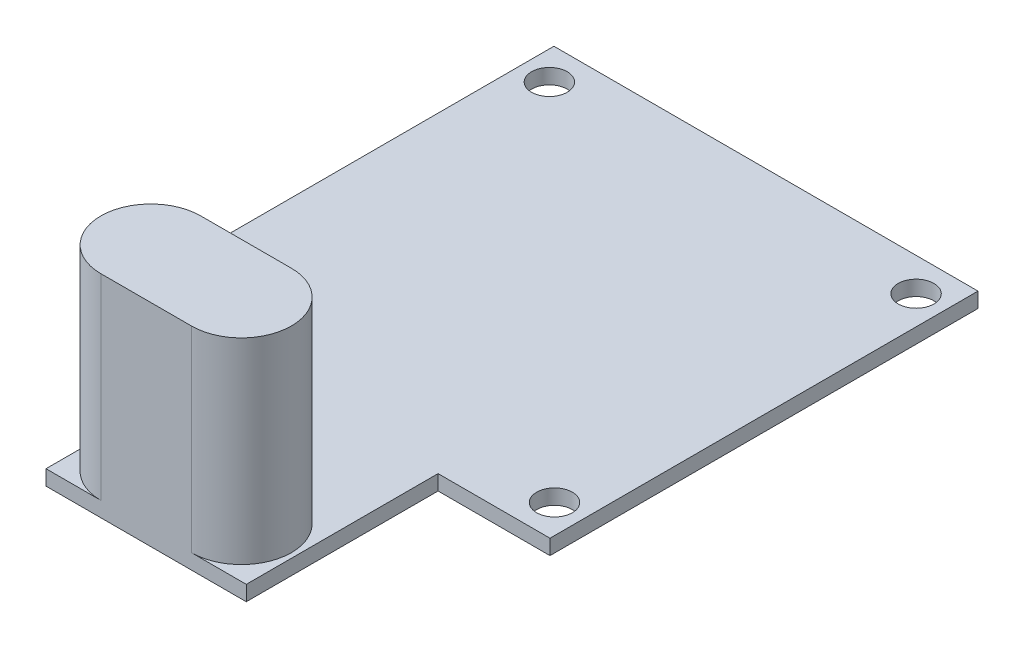
ISO-10303-21;
HEADER;
FILE_DESCRIPTION(('STEP AP214'),'2;1');
FILE_NAME('part.step','',(''),(''),'','','');
FILE_SCHEMA(('AUTOMOTIVE_DESIGN { 1 0 10303 214 1 1 1 1 }'));
ENDSEC;
DATA;
#1=APPLICATION_CONTEXT('core data for automotive mechanical design processes');
#2=APPLICATION_PROTOCOL_DEFINITION('international standard','automotive_design',2000,#1);
#3=PRODUCT_CONTEXT('',#1,'mechanical');
#4=PRODUCT('Part','Part','',(#3));
#5=PRODUCT_RELATED_PRODUCT_CATEGORY('part','',(#4));
#6=PRODUCT_DEFINITION_FORMATION('','',#4);
#7=PRODUCT_DEFINITION_CONTEXT('part definition',#1,'design');
#8=PRODUCT_DEFINITION('design','',#6,#7);
#9=PRODUCT_DEFINITION_SHAPE('','',#8);
#10=(LENGTH_UNIT() NAMED_UNIT(*) SI_UNIT(.MILLI.,.METRE.));
#11=(NAMED_UNIT(*) PLANE_ANGLE_UNIT() SI_UNIT($,.RADIAN.));
#12=(NAMED_UNIT(*) SI_UNIT($,.STERADIAN.) SOLID_ANGLE_UNIT());
#13=UNCERTAINTY_MEASURE_WITH_UNIT(LENGTH_MEASURE(1.E-05),#10,'distance_accuracy_value','');
#14=(GEOMETRIC_REPRESENTATION_CONTEXT(3) GLOBAL_UNCERTAINTY_ASSIGNED_CONTEXT((#13)) GLOBAL_UNIT_ASSIGNED_CONTEXT((#10,
#11,#12)) REPRESENTATION_CONTEXT('',''));
#15=CARTESIAN_POINT('',(0.,0.,0.));
#16=DIRECTION('',(0.,0.,1.));
#17=DIRECTION('',(1.,0.,0.));
#18=AXIS2_PLACEMENT_3D('',#15,#16,#17);
#19=CARTESIAN_POINT('',(0.,0.635,0.));
#20=DIRECTION('',(1.,0.,0.));
#21=DIRECTION('',(0.,0.,-1.));
#22=AXIS2_PLACEMENT_3D('',#19,#20,#21);
#23=PLANE('',#22);
#24=DIRECTION('',(0.,0.,1.));
#25=VECTOR('',#24,1.);
#26=CARTESIAN_POINT('',(0.,-0.635,0.));
#27=LINE('',#26,#25);
#28=CARTESIAN_POINT('',(0.,-0.635,-35.9918));
#29=VERTEX_POINT('',#28);
#30=CARTESIAN_POINT('',(0.,-0.635,0.));
#31=VERTEX_POINT('',#30);
#32=EDGE_CURVE('E153',#29,#31,#27,.T.);
#33=ORIENTED_EDGE('',*,*,#32,.T.);
#34=DIRECTION('',(0.,-1.,0.));
#35=VECTOR('',#34,1.);
#36=CARTESIAN_POINT('',(0.,0.635,0.));
#37=LINE('',#36,#35);
#38=CARTESIAN_POINT('',(0.,0.635,0.));
#39=VERTEX_POINT('',#38);
#40=EDGE_CURVE('E11',#39,#31,#37,.T.);
#41=ORIENTED_EDGE('',*,*,#40,.F.);
#42=DIRECTION('',(0.,0.,1.));
#43=VECTOR('',#42,1.);
#44=CARTESIAN_POINT('',(0.,0.635,0.));
#45=LINE('',#44,#43);
#46=CARTESIAN_POINT('',(0.,0.635,-35.9918));
#47=VERTEX_POINT('',#46);
#48=EDGE_CURVE('E162',#47,#39,#45,.T.);
#49=ORIENTED_EDGE('',*,*,#48,.F.);
#50=DIRECTION('',(0.,-1.,0.));
#51=VECTOR('',#50,1.);
#52=CARTESIAN_POINT('',(0.,0.635,-35.9918));
#53=LINE('',#52,#51);
#54=EDGE_CURVE('E180',#47,#29,#53,.T.);
#55=ORIENTED_EDGE('',*,*,#54,.T.);
#56=EDGE_LOOP('',(#33,#41,#49,#55));
#57=FACE_BOUND('',#56,.T.);
#58=ADVANCED_FACE('F43',(#57),#23,.F.);
#59=CARTESIAN_POINT('',(0.,0.635,0.));
#60=DIRECTION('',(0.,0.,-1.));
#61=DIRECTION('',(-1.,0.,0.));
#62=AXIS2_PLACEMENT_3D('',#59,#60,#61);
#63=PLANE('',#62);
#64=DIRECTION('',(1.,0.,0.));
#65=VECTOR('',#64,1.);
#66=CARTESIAN_POINT('',(0.,-0.635,0.));
#67=LINE('',#66,#65);
#68=CARTESIAN_POINT('',(9.4107,-0.635,0.));
#69=VERTEX_POINT('',#68);
#70=EDGE_CURVE('E156',#31,#69,#67,.T.);
#71=ORIENTED_EDGE('',*,*,#70,.T.);
#72=DIRECTION('',(0.,-1.,0.));
#73=VECTOR('',#72,1.);
#74=CARTESIAN_POINT('',(9.4107,0.635,0.));
#75=LINE('',#74,#73);
#76=CARTESIAN_POINT('',(9.4107,0.635,0.));
#77=VERTEX_POINT('',#76);
#78=EDGE_CURVE('E50',#77,#69,#75,.T.);
#79=ORIENTED_EDGE('',*,*,#78,.F.);
#80=DIRECTION('',(1.,0.,0.));
#81=VECTOR('',#80,1.);
#82=CARTESIAN_POINT('',(0.,0.635,0.));
#83=LINE('',#82,#81);
#84=EDGE_CURVE('E165',#39,#77,#83,.T.);
#85=ORIENTED_EDGE('',*,*,#84,.F.);
#86=ORIENTED_EDGE('',*,*,#40,.T.);
#87=EDGE_LOOP('',(#71,#79,#85,#86));
#88=FACE_BOUND('',#87,.T.);
#89=ADVANCED_FACE('F256',(#88),#63,.F.);
#90=CARTESIAN_POINT('',(9.4107,0.635,0.));
#91=DIRECTION('',(1.,0.,0.));
#92=DIRECTION('',(0.,0.,-1.));
#93=AXIS2_PLACEMENT_3D('',#90,#91,#92);
#94=PLANE('',#93);
#95=DIRECTION('',(0.,0.,1.));
#96=VECTOR('',#95,1.);
#97=CARTESIAN_POINT('',(9.4107,-0.635,0.));
#98=LINE('',#97,#96);
#99=CARTESIAN_POINT('',(9.4107,-0.635,16.129));
#100=VERTEX_POINT('',#99);
#101=EDGE_CURVE('E183',#69,#100,#98,.T.);
#102=ORIENTED_EDGE('',*,*,#101,.T.);
#103=DIRECTION('',(0.,-1.,0.));
#104=VECTOR('',#103,1.);
#105=CARTESIAN_POINT('',(9.4107,0.635,16.129));
#106=LINE('',#105,#104);
#107=CARTESIAN_POINT('',(9.4107,0.635,16.129));
#108=VERTEX_POINT('',#107);
#109=EDGE_CURVE('E208',#108,#100,#106,.T.);
#110=ORIENTED_EDGE('',*,*,#109,.F.);
#111=DIRECTION('',(0.,0.,1.));
#112=VECTOR('',#111,1.);
#113=CARTESIAN_POINT('',(9.4107,0.635,0.));
#114=LINE('',#113,#112);
#115=EDGE_CURVE('E168',#77,#108,#114,.T.);
#116=ORIENTED_EDGE('',*,*,#115,.F.);
#117=ORIENTED_EDGE('',*,*,#78,.T.);
#118=EDGE_LOOP('',(#102,#110,#116,#117));
#119=FACE_BOUND('',#118,.T.);
#120=ADVANCED_FACE('F215',(#119),#94,.F.);
#121=CARTESIAN_POINT('',(9.4107,0.635,16.129));
#122=DIRECTION('',(0.,0.,-1.));
#123=DIRECTION('',(-1.,0.,0.));
#124=AXIS2_PLACEMENT_3D('',#121,#122,#123);
#125=PLANE('',#124);
#126=DIRECTION('',(1.,0.,0.));
#127=VECTOR('',#126,1.);
#128=CARTESIAN_POINT('',(9.4107,-0.635,16.129));
#129=LINE('',#128,#127);
#130=CARTESIAN_POINT('',(26.2509,-0.635,16.129));
#131=VERTEX_POINT('',#130);
#132=EDGE_CURVE('E185',#100,#131,#129,.T.);
#133=ORIENTED_EDGE('',*,*,#132,.T.);
#134=DIRECTION('',(0.,-1.,0.));
#135=VECTOR('',#134,1.);
#136=CARTESIAN_POINT('',(26.2509,0.635,16.129));
#137=LINE('',#136,#135);
#138=CARTESIAN_POINT('',(26.2509,0.635,16.129));
#139=VERTEX_POINT('',#138);
#140=EDGE_CURVE('E205',#139,#131,#137,.T.);
#141=ORIENTED_EDGE('',*,*,#140,.F.);
#142=DIRECTION('',(1.,0.,0.));
#143=VECTOR('',#142,1.);
#144=CARTESIAN_POINT('',(9.4107,0.635,16.129));
#145=LINE('',#144,#143);
#146=CARTESIAN_POINT('',(21.6408,0.635,16.129));
#147=VERTEX_POINT('',#146);
#148=EDGE_CURVE('E170',#147,#139,#145,.T.);
#149=ORIENTED_EDGE('',*,*,#148,.F.);
#150=DIRECTION('',(0.,-1.,0.));
#151=VECTOR('',#150,1.);
#152=CARTESIAN_POINT('',(21.6408,17.145,16.129));
#153=LINE('',#152,#151);
#154=CARTESIAN_POINT('',(21.6408,17.145,16.129));
#155=VERTEX_POINT('',#154);
#156=EDGE_CURVE('E137',#155,#147,#153,.T.);
#157=ORIENTED_EDGE('',*,*,#156,.F.);
#158=DIRECTION('',(1.,0.,0.));
#159=VECTOR('',#158,1.);
#160=CARTESIAN_POINT('',(14.0208,17.145,16.129));
#161=LINE('',#160,#159);
#162=CARTESIAN_POINT('',(14.0208,17.145,16.129));
#163=VERTEX_POINT('',#162);
#164=EDGE_CURVE('E130',#163,#155,#161,.T.);
#165=ORIENTED_EDGE('',*,*,#164,.F.);
#166=DIRECTION('',(0.,-1.,0.));
#167=VECTOR('',#166,1.);
#168=CARTESIAN_POINT('',(14.0208,17.145,16.129));
#169=LINE('',#168,#167);
#170=CARTESIAN_POINT('',(14.0208,0.635,16.129));
#171=VERTEX_POINT('',#170);
#172=EDGE_CURVE('E135',#163,#171,#169,.T.);
#173=ORIENTED_EDGE('',*,*,#172,.T.);
#174=EDGE_CURVE('E171',#108,#171,#145,.T.);
#175=ORIENTED_EDGE('',*,*,#174,.F.);
#176=ORIENTED_EDGE('',*,*,#109,.T.);
#177=EDGE_LOOP('',(#133,#141,#149,#157,#165,#173,#175,#176));
#178=FACE_BOUND('',#177,.T.);
#179=ADVANCED_FACE('F132',(#178),#125,.F.);
#180=CARTESIAN_POINT('',(26.2509,0.635,0.));
#181=DIRECTION('',(-1.,0.,0.));
#182=DIRECTION('',(0.,0.,1.));
#183=AXIS2_PLACEMENT_3D('',#180,#181,#182);
#184=PLANE('',#183);
#185=DIRECTION('',(0.,0.,-1.));
#186=VECTOR('',#185,1.);
#187=CARTESIAN_POINT('',(26.2509,-0.635,0.));
#188=LINE('',#187,#186);
#189=CARTESIAN_POINT('',(26.2509,-0.635,0.));
#190=VERTEX_POINT('',#189);
#191=EDGE_CURVE('E187',#131,#190,#188,.T.);
#192=ORIENTED_EDGE('',*,*,#191,.T.);
#193=DIRECTION('',(0.,-1.,0.));
#194=VECTOR('',#193,1.);
#195=CARTESIAN_POINT('',(26.2509,0.635,0.));
#196=LINE('',#195,#194);
#197=CARTESIAN_POINT('',(26.2509,0.635,0.));
#198=VERTEX_POINT('',#197);
#199=EDGE_CURVE('E202',#198,#190,#196,.T.);
#200=ORIENTED_EDGE('',*,*,#199,.F.);
#201=DIRECTION('',(0.,0.,-1.));
#202=VECTOR('',#201,1.);
#203=CARTESIAN_POINT('',(26.2509,0.635,0.));
#204=LINE('',#203,#202);
#205=EDGE_CURVE('E173',#139,#198,#204,.T.);
#206=ORIENTED_EDGE('',*,*,#205,.F.);
#207=ORIENTED_EDGE('',*,*,#140,.T.);
#208=EDGE_LOOP('',(#192,#200,#206,#207));
#209=FACE_BOUND('',#208,.T.);
#210=ADVANCED_FACE('F227',(#209),#184,.F.);
#211=CARTESIAN_POINT('',(26.2509,0.635,0.));
#212=DIRECTION('',(0.,0.,-1.));
#213=DIRECTION('',(-1.,0.,0.));
#214=AXIS2_PLACEMENT_3D('',#211,#212,#213);
#215=PLANE('',#214);
#216=DIRECTION('',(1.,0.,0.));
#217=VECTOR('',#216,1.);
#218=CARTESIAN_POINT('',(26.2509,-0.635,0.));
#219=LINE('',#218,#217);
#220=CARTESIAN_POINT('',(35.6616,-0.635,0.));
#221=VERTEX_POINT('',#220);
#222=EDGE_CURVE('E189',#190,#221,#219,.T.);
#223=ORIENTED_EDGE('',*,*,#222,.T.);
#224=DIRECTION('',(0.,-1.,0.));
#225=VECTOR('',#224,1.);
#226=CARTESIAN_POINT('',(35.6616,0.635,0.));
#227=LINE('',#226,#225);
#228=CARTESIAN_POINT('',(35.6616,0.635,0.));
#229=VERTEX_POINT('',#228);
#230=EDGE_CURVE('E199',#229,#221,#227,.T.);
#231=ORIENTED_EDGE('',*,*,#230,.F.);
#232=DIRECTION('',(1.,0.,0.));
#233=VECTOR('',#232,1.);
#234=CARTESIAN_POINT('',(26.2509,0.635,0.));
#235=LINE('',#234,#233);
#236=EDGE_CURVE('E175',#198,#229,#235,.T.);
#237=ORIENTED_EDGE('',*,*,#236,.F.);
#238=ORIENTED_EDGE('',*,*,#199,.T.);
#239=EDGE_LOOP('',(#223,#231,#237,#238));
#240=FACE_BOUND('',#239,.T.);
#241=ADVANCED_FACE('F274',(#240),#215,.F.);
#242=CARTESIAN_POINT('',(35.6616,0.635,0.));
#243=DIRECTION('',(-1.,0.,0.));
#244=DIRECTION('',(0.,0.,1.));
#245=AXIS2_PLACEMENT_3D('',#242,#243,#244);
#246=PLANE('',#245);
#247=DIRECTION('',(0.,0.,-1.));
#248=VECTOR('',#247,1.);
#249=CARTESIAN_POINT('',(35.6616,-0.635,0.));
#250=LINE('',#249,#248);
#251=CARTESIAN_POINT('',(35.6616,-0.635,-35.9918));
#252=VERTEX_POINT('',#251);
#253=EDGE_CURVE('E191',#221,#252,#250,.T.);
#254=ORIENTED_EDGE('',*,*,#253,.T.);
#255=DIRECTION('',(0.,-1.,0.));
#256=VECTOR('',#255,1.);
#257=CARTESIAN_POINT('',(35.6616,0.635,-35.9918));
#258=LINE('',#257,#256);
#259=CARTESIAN_POINT('',(35.6616,0.635,-35.9918));
#260=VERTEX_POINT('',#259);
#261=EDGE_CURVE('E196',#260,#252,#258,.T.);
#262=ORIENTED_EDGE('',*,*,#261,.F.);
#263=DIRECTION('',(0.,0.,-1.));
#264=VECTOR('',#263,1.);
#265=CARTESIAN_POINT('',(35.6616,0.635,0.));
#266=LINE('',#265,#264);
#267=EDGE_CURVE('E177',#229,#260,#266,.T.);
#268=ORIENTED_EDGE('',*,*,#267,.F.);
#269=ORIENTED_EDGE('',*,*,#230,.T.);
#270=EDGE_LOOP('',(#254,#262,#268,#269));
#271=FACE_BOUND('',#270,.T.);
#272=ADVANCED_FACE('F272',(#271),#246,.F.);
#273=CARTESIAN_POINT('',(0.,0.635,-35.9918));
#274=DIRECTION('',(0.,0.,1.));
#275=DIRECTION('',(1.,0.,0.));
#276=AXIS2_PLACEMENT_3D('',#273,#274,#275);
#277=PLANE('',#276);
#278=DIRECTION('',(-1.,0.,0.));
#279=VECTOR('',#278,1.);
#280=CARTESIAN_POINT('',(0.,-0.635,-35.9918));
#281=LINE('',#280,#279);
#282=EDGE_CURVE('E166',#252,#29,#281,.T.);
#283=ORIENTED_EDGE('',*,*,#282,.T.);
#284=ORIENTED_EDGE('',*,*,#54,.F.);
#285=DIRECTION('',(-1.,0.,0.));
#286=VECTOR('',#285,1.);
#287=CARTESIAN_POINT('',(0.,0.635,-35.9918));
#288=LINE('',#287,#286);
#289=EDGE_CURVE('E179',#260,#47,#288,.T.);
#290=ORIENTED_EDGE('',*,*,#289,.F.);
#291=ORIENTED_EDGE('',*,*,#261,.T.);
#292=EDGE_LOOP('',(#283,#284,#290,#291));
#293=FACE_BOUND('',#292,.T.);
#294=ADVANCED_FACE('F267',(#293),#277,.F.);
#295=CARTESIAN_POINT('',(0.,0.635,0.));
#296=DIRECTION('',(0.,-1.,0.));
#297=DIRECTION('',(0.,0.,-1.));
#298=AXIS2_PLACEMENT_3D('',#295,#296,#297);
#299=PLANE('',#298);
#300=CARTESIAN_POINT('',(33.2486,0.635,-33.1978));
#301=DIRECTION('',(0.,1.,0.));
#302=DIRECTION('',(0.,0.,-1.));
#303=AXIS2_PLACEMENT_3D('',#300,#301,#302);
#304=CIRCLE('',#303,1.49987);
#305=CARTESIAN_POINT('',(33.2486,0.635,-34.69767));
#306=VERTEX_POINT('',#305);
#307=EDGE_CURVE('E415',#306,#306,#304,.T.);
#308=ORIENTED_EDGE('',*,*,#307,.F.);
#309=EDGE_LOOP('',(#308));
#310=FACE_BOUND('',#309,.T.);
#311=CARTESIAN_POINT('',(33.2486,0.635,-2.794));
#312=DIRECTION('',(0.,1.,0.));
#313=DIRECTION('',(0.,0.,1.));
#314=AXIS2_PLACEMENT_3D('',#311,#312,#313);
#315=CIRCLE('',#314,1.49987);
#316=CARTESIAN_POINT('',(33.2486,0.635,-1.29413));
#317=VERTEX_POINT('',#316);
#318=EDGE_CURVE('E417',#317,#317,#315,.T.);
#319=ORIENTED_EDGE('',*,*,#318,.F.);
#320=EDGE_LOOP('',(#319));
#321=FACE_BOUND('',#320,.T.);
#322=CARTESIAN_POINT('',(2.413,0.635,-2.794));
#323=DIRECTION('',(0.,1.,0.));
#324=DIRECTION('',(0.,0.,-1.));
#325=AXIS2_PLACEMENT_3D('',#322,#323,#324);
#326=CIRCLE('',#325,1.49987);
#327=CARTESIAN_POINT('',(2.413,0.635,-4.29387));
#328=VERTEX_POINT('',#327);
#329=EDGE_CURVE('E429',#328,#328,#326,.T.);
#330=ORIENTED_EDGE('',*,*,#329,.F.);
#331=EDGE_LOOP('',(#330));
#332=FACE_BOUND('',#331,.T.);
#333=CARTESIAN_POINT('',(2.413,0.635,-33.1978));
#334=DIRECTION('',(0.,1.,0.));
#335=DIRECTION('',(0.,0.,1.));
#336=AXIS2_PLACEMENT_3D('',#333,#334,#335);
#337=CIRCLE('',#336,1.49987);
#338=CARTESIAN_POINT('',(2.413,0.635,-31.69793));
#339=VERTEX_POINT('',#338);
#340=EDGE_CURVE('E241',#339,#339,#337,.T.);
#341=ORIENTED_EDGE('',*,*,#340,.F.);
#342=EDGE_LOOP('',(#341));
#343=FACE_BOUND('',#342,.T.);
#344=CARTESIAN_POINT('',(14.0208,0.635,11.9253));
#345=DIRECTION('',(0.,1.,0.));
#346=DIRECTION('',(0.,0.,1.));
#347=AXIS2_PLACEMENT_3D('',#344,#345,#346);
#348=CIRCLE('',#347,4.2037);
#349=CARTESIAN_POINT('',(14.0208,0.635,7.7216));
#350=VERTEX_POINT('',#349);
#351=EDGE_CURVE('E57',#350,#171,#348,.T.);
#352=ORIENTED_EDGE('',*,*,#351,.F.);
#353=DIRECTION('',(-1.,0.,0.));
#354=VECTOR('',#353,1.);
#355=CARTESIAN_POINT('',(14.0208,0.635,7.7216));
#356=LINE('',#355,#354);
#357=CARTESIAN_POINT('',(21.6408,0.635,7.7216));
#358=VERTEX_POINT('',#357);
#359=EDGE_CURVE('E150',#358,#350,#356,.T.);
#360=ORIENTED_EDGE('',*,*,#359,.F.);
#361=CARTESIAN_POINT('',(21.6408,0.635,11.9253));
#362=DIRECTION('',(0.,1.,0.));
#363=DIRECTION('',(0.,0.,1.));
#364=AXIS2_PLACEMENT_3D('',#361,#362,#363);
#365=CIRCLE('',#364,4.2037);
#366=EDGE_CURVE('E63',#147,#358,#365,.T.);
#367=ORIENTED_EDGE('',*,*,#366,.F.);
#368=ORIENTED_EDGE('',*,*,#148,.T.);
#369=ORIENTED_EDGE('',*,*,#205,.T.);
#370=ORIENTED_EDGE('',*,*,#236,.T.);
#371=ORIENTED_EDGE('',*,*,#267,.T.);
#372=ORIENTED_EDGE('',*,*,#289,.T.);
#373=ORIENTED_EDGE('',*,*,#48,.T.);
#374=ORIENTED_EDGE('',*,*,#84,.T.);
#375=ORIENTED_EDGE('',*,*,#115,.T.);
#376=ORIENTED_EDGE('',*,*,#174,.T.);
#377=EDGE_LOOP('',(#352,#360,#367,#368,#369,#370,#371,#372,#373,#374,#375,#376));
#378=FACE_BOUND('',#377,.T.);
#379=ADVANCED_FACE('F230',(#310,#321,#332,#343,#378),#299,.F.);
#380=CARTESIAN_POINT('',(0.,-0.635,0.));
#381=DIRECTION('',(0.,-1.,0.));
#382=DIRECTION('',(0.,0.,-1.));
#383=AXIS2_PLACEMENT_3D('',#380,#381,#382);
#384=PLANE('',#383);
#385=CARTESIAN_POINT('',(33.2486,-0.635,-33.1978));
#386=DIRECTION('',(0.,-1.,0.));
#387=DIRECTION('',(0.,0.,-1.));
#388=AXIS2_PLACEMENT_3D('',#385,#386,#387);
#389=CIRCLE('',#388,1.49987);
#390=CARTESIAN_POINT('',(33.2486,-0.635,-34.69767));
#391=VERTEX_POINT('',#390);
#392=EDGE_CURVE('E412',#391,#391,#389,.F.);
#393=ORIENTED_EDGE('',*,*,#392,.T.);
#394=EDGE_LOOP('',(#393));
#395=FACE_BOUND('',#394,.T.);
#396=CARTESIAN_POINT('',(33.2486,-0.635,-2.794));
#397=DIRECTION('',(0.,-1.,0.));
#398=DIRECTION('',(0.,0.,-1.));
#399=AXIS2_PLACEMENT_3D('',#396,#397,#398);
#400=CIRCLE('',#399,1.49987);
#401=CARTESIAN_POINT('',(33.2486,-0.635,-4.29387));
#402=VERTEX_POINT('',#401);
#403=EDGE_CURVE('E434',#402,#402,#400,.F.);
#404=ORIENTED_EDGE('',*,*,#403,.T.);
#405=EDGE_LOOP('',(#404));
#406=FACE_BOUND('',#405,.T.);
#407=CARTESIAN_POINT('',(2.413,-0.635,-2.794));
#408=DIRECTION('',(0.,-1.,0.));
#409=DIRECTION('',(0.,0.,-1.));
#410=AXIS2_PLACEMENT_3D('',#407,#408,#409);
#411=CIRCLE('',#410,1.49987);
#412=CARTESIAN_POINT('',(2.413,-0.635,-4.29387));
#413=VERTEX_POINT('',#412);
#414=EDGE_CURVE('E425',#413,#413,#411,.F.);
#415=ORIENTED_EDGE('',*,*,#414,.T.);
#416=EDGE_LOOP('',(#415));
#417=FACE_BOUND('',#416,.T.);
#418=CARTESIAN_POINT('',(2.413,-0.635,-33.1978));
#419=DIRECTION('',(0.,-1.,0.));
#420=DIRECTION('',(0.,0.,-1.));
#421=AXIS2_PLACEMENT_3D('',#418,#419,#420);
#422=CIRCLE('',#421,1.49987);
#423=CARTESIAN_POINT('',(2.413,-0.635,-34.69767));
#424=VERTEX_POINT('',#423);
#425=EDGE_CURVE('E423',#424,#424,#422,.F.);
#426=ORIENTED_EDGE('',*,*,#425,.T.);
#427=EDGE_LOOP('',(#426));
#428=FACE_BOUND('',#427,.T.);
#429=ORIENTED_EDGE('',*,*,#32,.F.);
#430=ORIENTED_EDGE('',*,*,#282,.F.);
#431=ORIENTED_EDGE('',*,*,#253,.F.);
#432=ORIENTED_EDGE('',*,*,#222,.F.);
#433=ORIENTED_EDGE('',*,*,#191,.F.);
#434=ORIENTED_EDGE('',*,*,#132,.F.);
#435=ORIENTED_EDGE('',*,*,#101,.F.);
#436=ORIENTED_EDGE('',*,*,#70,.F.);
#437=EDGE_LOOP('',(#429,#430,#431,#432,#433,#434,#435,#436));
#438=FACE_BOUND('',#437,.T.);
#439=ADVANCED_FACE('F221',(#395,#406,#417,#428,#438),#384,.T.);
#440=CARTESIAN_POINT('',(14.0208,17.145,11.9253));
#441=DIRECTION('',(0.,-1.,0.));
#442=DIRECTION('',(0.,0.,-1.));
#443=AXIS2_PLACEMENT_3D('',#440,#441,#442);
#444=CYLINDRICAL_SURFACE('',#443,4.2037);
#445=ORIENTED_EDGE('',*,*,#351,.T.);
#446=ORIENTED_EDGE('',*,*,#172,.F.);
#447=CARTESIAN_POINT('',(14.0208,17.145,11.9253));
#448=DIRECTION('',(0.,1.,0.));
#449=DIRECTION('',(0.,0.,1.));
#450=AXIS2_PLACEMENT_3D('',#447,#448,#449);
#451=CIRCLE('',#450,4.2037);
#452=CARTESIAN_POINT('',(14.0208,17.145,7.7216));
#453=VERTEX_POINT('',#452);
#454=EDGE_CURVE('E141',#453,#163,#451,.T.);
#455=ORIENTED_EDGE('',*,*,#454,.F.);
#456=DIRECTION('',(0.,-1.,0.));
#457=VECTOR('',#456,1.);
#458=CARTESIAN_POINT('',(14.0208,17.145,7.7216));
#459=LINE('',#458,#457);
#460=EDGE_CURVE('E237',#453,#350,#459,.T.);
#461=ORIENTED_EDGE('',*,*,#460,.T.);
#462=EDGE_LOOP('',(#445,#446,#455,#461));
#463=FACE_BOUND('',#462,.T.);
#464=ADVANCED_FACE('F152',(#463),#444,.T.);
#465=CARTESIAN_POINT('',(21.6408,17.145,11.9253));
#466=DIRECTION('',(0.,-1.,0.));
#467=DIRECTION('',(0.,0.,-1.));
#468=AXIS2_PLACEMENT_3D('',#465,#466,#467);
#469=CYLINDRICAL_SURFACE('',#468,4.2037);
#470=ORIENTED_EDGE('',*,*,#366,.T.);
#471=DIRECTION('',(0.,-1.,0.));
#472=VECTOR('',#471,1.);
#473=CARTESIAN_POINT('',(21.6408,17.145,7.7216));
#474=LINE('',#473,#472);
#475=CARTESIAN_POINT('',(21.6408,17.145,7.7216));
#476=VERTEX_POINT('',#475);
#477=EDGE_CURVE('E158',#476,#358,#474,.T.);
#478=ORIENTED_EDGE('',*,*,#477,.F.);
#479=CARTESIAN_POINT('',(21.6408,17.145,11.9253));
#480=DIRECTION('',(0.,1.,0.));
#481=DIRECTION('',(0.,0.,1.));
#482=AXIS2_PLACEMENT_3D('',#479,#480,#481);
#483=CIRCLE('',#482,4.2037);
#484=EDGE_CURVE('E140',#155,#476,#483,.T.);
#485=ORIENTED_EDGE('',*,*,#484,.F.);
#486=ORIENTED_EDGE('',*,*,#156,.T.);
#487=EDGE_LOOP('',(#470,#478,#485,#486));
#488=FACE_BOUND('',#487,.T.);
#489=ADVANCED_FACE('F233',(#488),#469,.T.);
#490=CARTESIAN_POINT('',(14.0208,17.145,7.7216));
#491=DIRECTION('',(0.,0.,1.));
#492=DIRECTION('',(1.,0.,0.));
#493=AXIS2_PLACEMENT_3D('',#490,#491,#492);
#494=PLANE('',#493);
#495=ORIENTED_EDGE('',*,*,#359,.T.);
#496=ORIENTED_EDGE('',*,*,#460,.F.);
#497=DIRECTION('',(-1.,0.,0.));
#498=VECTOR('',#497,1.);
#499=CARTESIAN_POINT('',(14.0208,17.145,7.7216));
#500=LINE('',#499,#498);
#501=EDGE_CURVE('E146',#476,#453,#500,.T.);
#502=ORIENTED_EDGE('',*,*,#501,.F.);
#503=ORIENTED_EDGE('',*,*,#477,.T.);
#504=EDGE_LOOP('',(#495,#496,#502,#503));
#505=FACE_BOUND('',#504,.T.);
#506=ADVANCED_FACE('F245',(#505),#494,.F.);
#507=CARTESIAN_POINT('',(14.0208,17.145,11.9253));
#508=DIRECTION('',(0.,1.,0.));
#509=DIRECTION('',(0.,0.,1.));
#510=AXIS2_PLACEMENT_3D('',#507,#508,#509);
#511=PLANE('',#510);
#512=ORIENTED_EDGE('',*,*,#454,.T.);
#513=ORIENTED_EDGE('',*,*,#164,.T.);
#514=ORIENTED_EDGE('',*,*,#484,.T.);
#515=ORIENTED_EDGE('',*,*,#501,.T.);
#516=EDGE_LOOP('',(#512,#513,#514,#515));
#517=FACE_BOUND('',#516,.T.);
#518=ADVANCED_FACE('F144',(#517),#511,.T.);
#519=CARTESIAN_POINT('',(2.413,-0.636,-33.1978));
#520=DIRECTION('',(0.,1.,0.));
#521=DIRECTION('',(0.,0.,1.));
#522=AXIS2_PLACEMENT_3D('',#519,#520,#521);
#523=CYLINDRICAL_SURFACE('',#522,1.49987);
#524=ORIENTED_EDGE('',*,*,#425,.F.);
#525=EDGE_LOOP('',(#524));
#526=FACE_BOUND('',#525,.T.);
#527=ORIENTED_EDGE('',*,*,#340,.T.);
#528=EDGE_LOOP('',(#527));
#529=FACE_BOUND('',#528,.T.);
#530=ADVANCED_FACE('F252',(#526,#529),#523,.F.);
#531=CARTESIAN_POINT('',(2.413,-0.636,-2.794));
#532=DIRECTION('',(0.,1.,0.));
#533=DIRECTION('',(0.,0.,1.));
#534=AXIS2_PLACEMENT_3D('',#531,#532,#533);
#535=CYLINDRICAL_SURFACE('',#534,1.49987);
#536=ORIENTED_EDGE('',*,*,#414,.F.);
#537=EDGE_LOOP('',(#536));
#538=FACE_BOUND('',#537,.T.);
#539=ORIENTED_EDGE('',*,*,#329,.T.);
#540=EDGE_LOOP('',(#539));
#541=FACE_BOUND('',#540,.T.);
#542=ADVANCED_FACE('F376',(#538,#541),#535,.F.);
#543=CARTESIAN_POINT('',(33.2486,-0.636,-2.794));
#544=DIRECTION('',(0.,1.,0.));
#545=DIRECTION('',(0.,0.,1.));
#546=AXIS2_PLACEMENT_3D('',#543,#544,#545);
#547=CYLINDRICAL_SURFACE('',#546,1.49987);
#548=ORIENTED_EDGE('',*,*,#403,.F.);
#549=EDGE_LOOP('',(#548));
#550=FACE_BOUND('',#549,.T.);
#551=ORIENTED_EDGE('',*,*,#318,.T.);
#552=EDGE_LOOP('',(#551));
#553=FACE_BOUND('',#552,.T.);
#554=ADVANCED_FACE('F386',(#550,#553),#547,.F.);
#555=CARTESIAN_POINT('',(33.2486,-0.636,-33.1978));
#556=DIRECTION('',(0.,1.,0.));
#557=DIRECTION('',(0.,0.,1.));
#558=AXIS2_PLACEMENT_3D('',#555,#556,#557);
#559=CYLINDRICAL_SURFACE('',#558,1.49987);
#560=ORIENTED_EDGE('',*,*,#392,.F.);
#561=EDGE_LOOP('',(#560));
#562=FACE_BOUND('',#561,.T.);
#563=ORIENTED_EDGE('',*,*,#307,.T.);
#564=EDGE_LOOP('',(#563));
#565=FACE_BOUND('',#564,.T.);
#566=ADVANCED_FACE('F396',(#562,#565),#559,.F.);
#567=CLOSED_SHELL('',(#58,#89,#120,#179,#210,#241,#272,#294,#379,#439,#464,#489,#506,#518,#530,
#542,#554,#566));
#568=MANIFOLD_SOLID_BREP('B2',#567);
#569=ADVANCED_BREP_SHAPE_REPRESENTATION('',(#18,#568),#14);
#570=SHAPE_DEFINITION_REPRESENTATION(#9,#569);
ENDSEC;
END-ISO-10303-21;
